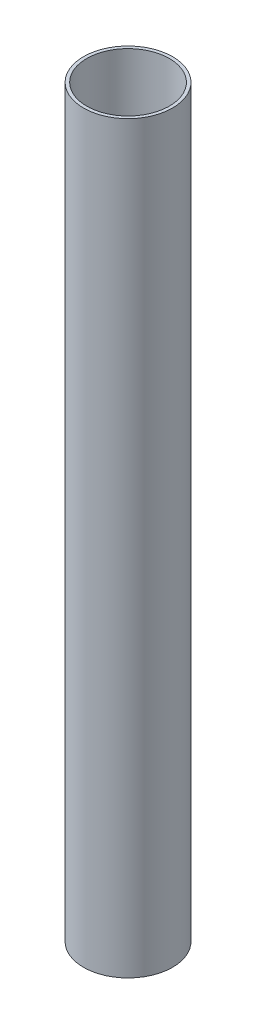
ISO-10303-21;
HEADER;
FILE_DESCRIPTION(('STEP AP214'),'2;1');
FILE_NAME('part.step','',(''),(''),'','','');
FILE_SCHEMA(('AUTOMOTIVE_DESIGN { 1 0 10303 214 1 1 1 1 }'));
ENDSEC;
DATA;
#1=APPLICATION_CONTEXT('core data for automotive mechanical design processes');
#2=APPLICATION_PROTOCOL_DEFINITION('international standard','automotive_design',2000,#1);
#3=PRODUCT_CONTEXT('',#1,'mechanical');
#4=PRODUCT('Part','Part','',(#3));
#5=PRODUCT_RELATED_PRODUCT_CATEGORY('part','',(#4));
#6=PRODUCT_DEFINITION_FORMATION('','',#4);
#7=PRODUCT_DEFINITION_CONTEXT('part definition',#1,'design');
#8=PRODUCT_DEFINITION('design','',#6,#7);
#9=PRODUCT_DEFINITION_SHAPE('','',#8);
#10=(LENGTH_UNIT() NAMED_UNIT(*) SI_UNIT(.MILLI.,.METRE.));
#11=(NAMED_UNIT(*) PLANE_ANGLE_UNIT() SI_UNIT($,.RADIAN.));
#12=(NAMED_UNIT(*) SI_UNIT($,.STERADIAN.) SOLID_ANGLE_UNIT());
#13=UNCERTAINTY_MEASURE_WITH_UNIT(LENGTH_MEASURE(1.E-05),#10,'distance_accuracy_value','');
#14=(GEOMETRIC_REPRESENTATION_CONTEXT(3) GLOBAL_UNCERTAINTY_ASSIGNED_CONTEXT((#13)) GLOBAL_UNIT_ASSIGNED_CONTEXT((#10,
#11,#12)) REPRESENTATION_CONTEXT('',''));
#15=CARTESIAN_POINT('',(0.,0.,0.));
#16=DIRECTION('',(0.,0.,1.));
#17=DIRECTION('',(1.,0.,0.));
#18=AXIS2_PLACEMENT_3D('',#15,#16,#17);
#19=CARTESIAN_POINT('',(0.,336.,0.));
#20=DIRECTION('',(0.,1.,0.));
#21=DIRECTION('',(0.,0.,1.));
#22=AXIS2_PLACEMENT_3D('',#19,#20,#21);
#23=PLANE('',#22);
#24=CARTESIAN_POINT('',(0.,336.,0.));
#25=DIRECTION('',(0.,1.,0.));
#26=DIRECTION('',(0.,0.,1.));
#27=AXIS2_PLACEMENT_3D('',#24,#25,#26);
#28=CIRCLE('',#27,20.1);
#29=CARTESIAN_POINT('',(0.,336.,-20.1));
#30=VERTEX_POINT('',#29);
#31=EDGE_CURVE('E10',#30,#30,#28,.T.);
#32=ORIENTED_EDGE('',*,*,#31,.T.);
#33=EDGE_LOOP('',(#32));
#34=FACE_BOUND('',#33,.T.);
#35=CARTESIAN_POINT('',(0.,336.,0.));
#36=DIRECTION('',(0.,1.,0.));
#37=DIRECTION('',(0.,0.,1.));
#38=AXIS2_PLACEMENT_3D('',#35,#36,#37);
#39=CIRCLE('',#38,18.65);
#40=CARTESIAN_POINT('',(0.,336.,-18.65));
#41=VERTEX_POINT('',#40);
#42=EDGE_CURVE('E47',#41,#41,#39,.T.);
#43=ORIENTED_EDGE('',*,*,#42,.F.);
#44=EDGE_LOOP('',(#43));
#45=FACE_BOUND('',#44,.T.);
#46=ADVANCED_FACE('F36',(#34,#45),#23,.T.);
#47=CARTESIAN_POINT('',(0.,0.,0.));
#48=DIRECTION('',(0.,1.,0.));
#49=DIRECTION('',(0.,0.,1.));
#50=AXIS2_PLACEMENT_3D('',#47,#48,#49);
#51=PLANE('',#50);
#52=CARTESIAN_POINT('',(0.,0.,0.));
#53=DIRECTION('',(0.,1.,0.));
#54=DIRECTION('',(0.,0.,1.));
#55=AXIS2_PLACEMENT_3D('',#52,#53,#54);
#56=CIRCLE('',#55,20.1);
#57=CARTESIAN_POINT('',(0.,0.,-20.1));
#58=VERTEX_POINT('',#57);
#59=EDGE_CURVE('E40',#58,#58,#56,.T.);
#60=ORIENTED_EDGE('',*,*,#59,.F.);
#61=EDGE_LOOP('',(#60));
#62=FACE_BOUND('',#61,.T.);
#63=CARTESIAN_POINT('',(0.,0.,0.));
#64=DIRECTION('',(0.,1.,0.));
#65=DIRECTION('',(0.,0.,1.));
#66=AXIS2_PLACEMENT_3D('',#63,#64,#65);
#67=CIRCLE('',#66,18.65);
#68=CARTESIAN_POINT('',(0.,0.,-18.65));
#69=VERTEX_POINT('',#68);
#70=EDGE_CURVE('E49',#69,#69,#67,.T.);
#71=ORIENTED_EDGE('',*,*,#70,.T.);
#72=EDGE_LOOP('',(#71));
#73=FACE_BOUND('',#72,.T.);
#74=ADVANCED_FACE('F59',(#62,#73),#51,.F.);
#75=CARTESIAN_POINT('',(0.,336.,0.));
#76=DIRECTION('',(0.,-1.,0.));
#77=DIRECTION('',(0.,0.,-1.));
#78=AXIS2_PLACEMENT_3D('',#75,#76,#77);
#79=CYLINDRICAL_SURFACE('',#78,20.1);
#80=CARTESIAN_POINT('',(0.,336.,-20.1));
#81=CARTESIAN_POINT('',(0.,332.5,-20.1));
#82=CARTESIAN_POINT('',(0.,329.,-20.1));
#83=CARTESIAN_POINT('',(0.,322.,-20.1));
#84=CARTESIAN_POINT('',(0.,318.5,-20.1));
#85=CARTESIAN_POINT('',(0.,311.5,-20.1));
#86=CARTESIAN_POINT('',(0.,308.,-20.1));
#87=CARTESIAN_POINT('',(0.,301.,-20.1));
#88=CARTESIAN_POINT('',(0.,297.5,-20.1));
#89=CARTESIAN_POINT('',(0.,290.5,-20.1));
#90=CARTESIAN_POINT('',(0.,287.,-20.1));
#91=CARTESIAN_POINT('',(0.,280.,-20.1));
#92=CARTESIAN_POINT('',(0.,276.5,-20.1));
#93=CARTESIAN_POINT('',(0.,269.5,-20.1));
#94=CARTESIAN_POINT('',(0.,266.,-20.1));
#95=CARTESIAN_POINT('',(0.,259.,-20.1));
#96=CARTESIAN_POINT('',(0.,255.5,-20.1));
#97=CARTESIAN_POINT('',(0.,248.5,-20.1));
#98=CARTESIAN_POINT('',(0.,245.,-20.1));
#99=CARTESIAN_POINT('',(0.,238.,-20.1));
#100=CARTESIAN_POINT('',(0.,234.5,-20.1));
#101=CARTESIAN_POINT('',(0.,227.5,-20.1));
#102=CARTESIAN_POINT('',(0.,224.,-20.1));
#103=CARTESIAN_POINT('',(0.,217.,-20.1));
#104=CARTESIAN_POINT('',(0.,213.5,-20.1));
#105=CARTESIAN_POINT('',(0.,206.5,-20.1));
#106=CARTESIAN_POINT('',(0.,203.,-20.1));
#107=CARTESIAN_POINT('',(0.,196.,-20.1));
#108=CARTESIAN_POINT('',(0.,192.5,-20.1));
#109=CARTESIAN_POINT('',(0.,185.5,-20.1));
#110=CARTESIAN_POINT('',(0.,182.,-20.1));
#111=CARTESIAN_POINT('',(0.,175.,-20.1));
#112=CARTESIAN_POINT('',(0.,171.5,-20.1));
#113=CARTESIAN_POINT('',(0.,164.5,-20.1));
#114=CARTESIAN_POINT('',(0.,161.,-20.1));
#115=CARTESIAN_POINT('',(0.,154.,-20.1));
#116=CARTESIAN_POINT('',(0.,150.5,-20.1));
#117=CARTESIAN_POINT('',(0.,143.5,-20.1));
#118=CARTESIAN_POINT('',(0.,140.,-20.1));
#119=CARTESIAN_POINT('',(0.,133.,-20.1));
#120=CARTESIAN_POINT('',(0.,129.5,-20.1));
#121=CARTESIAN_POINT('',(0.,122.5,-20.1));
#122=CARTESIAN_POINT('',(0.,119.,-20.1));
#123=CARTESIAN_POINT('',(0.,112.,-20.1));
#124=CARTESIAN_POINT('',(0.,108.5,-20.1));
#125=CARTESIAN_POINT('',(0.,101.5,-20.1));
#126=CARTESIAN_POINT('',(0.,98.,-20.1));
#127=CARTESIAN_POINT('',(0.,91.,-20.1));
#128=CARTESIAN_POINT('',(0.,87.5,-20.1));
#129=CARTESIAN_POINT('',(0.,80.5,-20.1));
#130=CARTESIAN_POINT('',(0.,77.,-20.1));
#131=CARTESIAN_POINT('',(0.,70.,-20.1));
#132=CARTESIAN_POINT('',(0.,66.5,-20.1));
#133=CARTESIAN_POINT('',(0.,59.5,-20.1));
#134=CARTESIAN_POINT('',(0.,56.,-20.1));
#135=CARTESIAN_POINT('',(0.,49.,-20.1));
#136=CARTESIAN_POINT('',(0.,45.5,-20.1));
#137=CARTESIAN_POINT('',(0.,38.5,-20.1));
#138=CARTESIAN_POINT('',(0.,35.,-20.1));
#139=CARTESIAN_POINT('',(0.,28.,-20.1));
#140=CARTESIAN_POINT('',(0.,24.5,-20.1));
#141=CARTESIAN_POINT('',(0.,17.5,-20.1));
#142=CARTESIAN_POINT('',(0.,14.,-20.1));
#143=CARTESIAN_POINT('',(0.,7.,-20.1));
#144=CARTESIAN_POINT('',(0.,3.5,-20.1));
#145=CARTESIAN_POINT('',(0.,0.,-20.1));
#146=B_SPLINE_CURVE_WITH_KNOTS('',3,(#80,#81,#82,#83,#84,#85,#86,#87,#88,#89,#90,#91,#92,#93,
#94,#95,#96,#97,#98,#99,#100,#101,#102,#103,#104,#105,#106,#107,#108,#109,#110,#111,#112,#113,
#114,#115,#116,#117,#118,#119,#120,#121,#122,#123,#124,#125,#126,#127,#128,#129,#130,#131,#132,
#133,#134,#135,#136,#137,#138,#139,#140,#141,#142,#143,#144,#145),.UNSPECIFIED.,.F.,.F.,(4,2,2,
2,2,2,2,2,2,2,2,2,2,2,2,2,2,2,2,2,2,2,2,2,2,2,2,2,2,2,2,2,4),(0.,10.5,21.,31.5,42.,52.5,63.,
73.5,84.,94.5,105.,115.5,126.,136.5,147.,157.5,168.,178.5,189.,199.5,210.,220.5,231.,241.5,252.,
262.5,273.,283.5,294.,304.5,315.,325.5,336.),.UNSPECIFIED.);
#147=EDGE_CURVE('BSEAM38',#30,#58,#146,.T.);
#148=ORIENTED_EDGE('',*,*,#31,.F.);
#149=ORIENTED_EDGE('',*,*,#59,.T.);
#150=ORIENTED_EDGE('',*,*,#147,.T.);
#151=ORIENTED_EDGE('',*,*,#147,.F.);
#152=EDGE_LOOP('',(#148,#150,#149,#151));
#153=FACE_BOUND('',#152,.T.);
#154=ADVANCED_FACE('F38',(#153),#79,.T.);
#155=CARTESIAN_POINT('',(0.,336.,0.));
#156=DIRECTION('',(0.,-1.,0.));
#157=DIRECTION('',(0.,0.,-1.));
#158=AXIS2_PLACEMENT_3D('',#155,#156,#157);
#159=CYLINDRICAL_SURFACE('',#158,18.65);
#160=CARTESIAN_POINT('',(0.,336.,-18.65));
#161=CARTESIAN_POINT('',(0.,332.5,-18.65));
#162=CARTESIAN_POINT('',(0.,329.,-18.65));
#163=CARTESIAN_POINT('',(0.,322.,-18.65));
#164=CARTESIAN_POINT('',(0.,318.5,-18.65));
#165=CARTESIAN_POINT('',(0.,311.5,-18.65));
#166=CARTESIAN_POINT('',(0.,308.,-18.65));
#167=CARTESIAN_POINT('',(0.,301.,-18.65));
#168=CARTESIAN_POINT('',(0.,297.5,-18.65));
#169=CARTESIAN_POINT('',(0.,290.5,-18.65));
#170=CARTESIAN_POINT('',(0.,287.,-18.65));
#171=CARTESIAN_POINT('',(0.,280.,-18.65));
#172=CARTESIAN_POINT('',(0.,276.5,-18.65));
#173=CARTESIAN_POINT('',(0.,269.5,-18.65));
#174=CARTESIAN_POINT('',(0.,266.,-18.65));
#175=CARTESIAN_POINT('',(0.,259.,-18.65));
#176=CARTESIAN_POINT('',(0.,255.5,-18.65));
#177=CARTESIAN_POINT('',(0.,248.5,-18.65));
#178=CARTESIAN_POINT('',(0.,245.,-18.65));
#179=CARTESIAN_POINT('',(0.,238.,-18.65));
#180=CARTESIAN_POINT('',(0.,234.5,-18.65));
#181=CARTESIAN_POINT('',(0.,227.5,-18.65));
#182=CARTESIAN_POINT('',(0.,224.,-18.65));
#183=CARTESIAN_POINT('',(0.,217.,-18.65));
#184=CARTESIAN_POINT('',(0.,213.5,-18.65));
#185=CARTESIAN_POINT('',(0.,206.5,-18.65));
#186=CARTESIAN_POINT('',(0.,203.,-18.65));
#187=CARTESIAN_POINT('',(0.,196.,-18.65));
#188=CARTESIAN_POINT('',(0.,192.5,-18.65));
#189=CARTESIAN_POINT('',(0.,185.5,-18.65));
#190=CARTESIAN_POINT('',(0.,182.,-18.65));
#191=CARTESIAN_POINT('',(0.,175.,-18.65));
#192=CARTESIAN_POINT('',(0.,171.5,-18.65));
#193=CARTESIAN_POINT('',(0.,164.5,-18.65));
#194=CARTESIAN_POINT('',(0.,161.,-18.65));
#195=CARTESIAN_POINT('',(0.,154.,-18.65));
#196=CARTESIAN_POINT('',(0.,150.5,-18.65));
#197=CARTESIAN_POINT('',(0.,143.5,-18.65));
#198=CARTESIAN_POINT('',(0.,140.,-18.65));
#199=CARTESIAN_POINT('',(0.,133.,-18.65));
#200=CARTESIAN_POINT('',(0.,129.5,-18.65));
#201=CARTESIAN_POINT('',(0.,122.5,-18.65));
#202=CARTESIAN_POINT('',(0.,119.,-18.65));
#203=CARTESIAN_POINT('',(0.,112.,-18.65));
#204=CARTESIAN_POINT('',(0.,108.5,-18.65));
#205=CARTESIAN_POINT('',(0.,101.5,-18.65));
#206=CARTESIAN_POINT('',(0.,98.,-18.65));
#207=CARTESIAN_POINT('',(0.,91.,-18.65));
#208=CARTESIAN_POINT('',(0.,87.5,-18.65));
#209=CARTESIAN_POINT('',(0.,80.5,-18.65));
#210=CARTESIAN_POINT('',(0.,77.,-18.65));
#211=CARTESIAN_POINT('',(0.,70.,-18.65));
#212=CARTESIAN_POINT('',(0.,66.5,-18.65));
#213=CARTESIAN_POINT('',(0.,59.5,-18.65));
#214=CARTESIAN_POINT('',(0.,56.,-18.65));
#215=CARTESIAN_POINT('',(0.,49.,-18.65));
#216=CARTESIAN_POINT('',(0.,45.5,-18.65));
#217=CARTESIAN_POINT('',(0.,38.5,-18.65));
#218=CARTESIAN_POINT('',(0.,35.,-18.65));
#219=CARTESIAN_POINT('',(0.,28.,-18.65));
#220=CARTESIAN_POINT('',(0.,24.5,-18.65));
#221=CARTESIAN_POINT('',(0.,17.5,-18.65));
#222=CARTESIAN_POINT('',(0.,14.,-18.65));
#223=CARTESIAN_POINT('',(0.,7.,-18.65));
#224=CARTESIAN_POINT('',(0.,3.5,-18.65));
#225=CARTESIAN_POINT('',(0.,0.,-18.65));
#226=B_SPLINE_CURVE_WITH_KNOTS('',3,(#160,#161,#162,#163,#164,#165,#166,#167,#168,#169,#170,
#171,#172,#173,#174,#175,#176,#177,#178,#179,#180,#181,#182,#183,#184,#185,#186,#187,#188,#189,
#190,#191,#192,#193,#194,#195,#196,#197,#198,#199,#200,#201,#202,#203,#204,#205,#206,#207,#208,
#209,#210,#211,#212,#213,#214,#215,#216,#217,#218,#219,#220,#221,#222,#223,#224,#225),
.UNSPECIFIED.,.F.,.F.,(4,2,2,2,2,2,2,2,2,2,2,2,2,2,2,2,2,2,2,2,2,2,2,2,2,2,2,2,2,2,2,2,4),(0.,
10.5,21.,31.5,42.,52.5,63.,73.5,84.,94.5,105.,115.5,126.,136.5,147.,157.5,168.,178.5,189.,199.5,
210.,220.5,231.,241.5,252.,262.5,273.,283.5,294.,304.5,315.,325.5,336.),.UNSPECIFIED.);
#227=EDGE_CURVE('BSEAM55',#41,#69,#226,.T.);
#228=ORIENTED_EDGE('',*,*,#42,.T.);
#229=ORIENTED_EDGE('',*,*,#70,.F.);
#230=ORIENTED_EDGE('',*,*,#227,.T.);
#231=ORIENTED_EDGE('',*,*,#227,.F.);
#232=EDGE_LOOP('',(#228,#230,#229,#231));
#233=FACE_BOUND('',#232,.T.);
#234=ADVANCED_FACE('F55',(#233),#159,.F.);
#235=CLOSED_SHELL('',(#46,#74,#154,#234));
#236=MANIFOLD_SOLID_BREP('B2',#235);
#237=ADVANCED_BREP_SHAPE_REPRESENTATION('',(#18,#236),#14);
#238=SHAPE_DEFINITION_REPRESENTATION(#9,#237);
ENDSEC;
END-ISO-10303-21;
